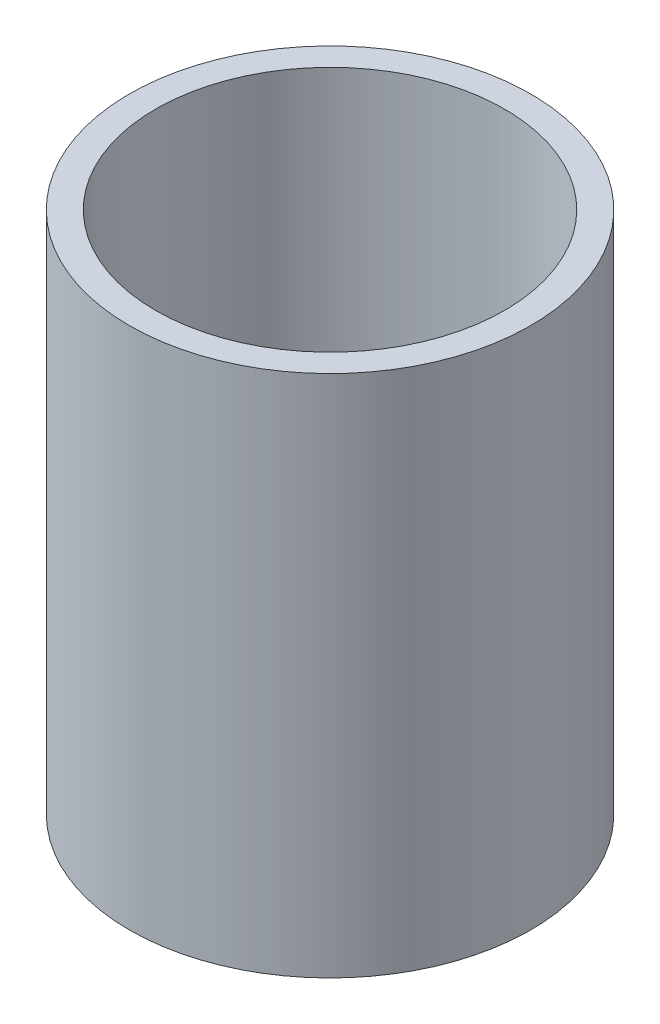
ISO-10303-21;
HEADER;
FILE_DESCRIPTION(('STEP AP214'),'2;1');
FILE_NAME('part.step','',(''),(''),'','','');
FILE_SCHEMA(('AUTOMOTIVE_DESIGN { 1 0 10303 214 1 1 1 1 }'));
ENDSEC;
DATA;
#1=APPLICATION_CONTEXT('core data for automotive mechanical design processes');
#2=APPLICATION_PROTOCOL_DEFINITION('international standard','automotive_design',2000,#1);
#3=PRODUCT_CONTEXT('',#1,'mechanical');
#4=PRODUCT('Part','Part','',(#3));
#5=PRODUCT_RELATED_PRODUCT_CATEGORY('part','',(#4));
#6=PRODUCT_DEFINITION_FORMATION('','',#4);
#7=PRODUCT_DEFINITION_CONTEXT('part definition',#1,'design');
#8=PRODUCT_DEFINITION('design','',#6,#7);
#9=PRODUCT_DEFINITION_SHAPE('','',#8);
#10=(LENGTH_UNIT() NAMED_UNIT(*) SI_UNIT(.MILLI.,.METRE.));
#11=(NAMED_UNIT(*) PLANE_ANGLE_UNIT() SI_UNIT($,.RADIAN.));
#12=(NAMED_UNIT(*) SI_UNIT($,.STERADIAN.) SOLID_ANGLE_UNIT());
#13=UNCERTAINTY_MEASURE_WITH_UNIT(LENGTH_MEASURE(1.E-05),#10,'distance_accuracy_value','');
#14=(GEOMETRIC_REPRESENTATION_CONTEXT(3) GLOBAL_UNCERTAINTY_ASSIGNED_CONTEXT((#13)) GLOBAL_UNIT_ASSIGNED_CONTEXT((#10,
#11,#12)) REPRESENTATION_CONTEXT('',''));
#15=CARTESIAN_POINT('',(0.,0.,0.));
#16=DIRECTION('',(0.,0.,1.));
#17=DIRECTION('',(1.,0.,0.));
#18=AXIS2_PLACEMENT_3D('',#15,#16,#17);
#19=CARTESIAN_POINT('',(0.,60.,0.));
#20=DIRECTION('',(0.,-1.,0.));
#21=DIRECTION('',(0.,0.,-1.));
#22=AXIS2_PLACEMENT_3D('',#19,#20,#21);
#23=CYLINDRICAL_SURFACE('',#22,23.);
#24=CARTESIAN_POINT('',(0.,60.,0.));
#25=DIRECTION('',(0.,1.,0.));
#26=DIRECTION('',(0.,0.,1.));
#27=AXIS2_PLACEMENT_3D('',#24,#25,#26);
#28=CIRCLE('',#27,23.);
#29=CARTESIAN_POINT('',(0.,60.,23.));
#30=VERTEX_POINT('',#29);
#31=EDGE_CURVE('E10',#30,#30,#28,.T.);
#32=ORIENTED_EDGE('',*,*,#31,.F.);
#33=EDGE_LOOP('',(#32));
#34=FACE_BOUND('',#33,.T.);
#35=CARTESIAN_POINT('',(0.,0.,0.));
#36=DIRECTION('',(0.,1.,0.));
#37=DIRECTION('',(0.,0.,1.));
#38=AXIS2_PLACEMENT_3D('',#35,#36,#37);
#39=CIRCLE('',#38,23.);
#40=CARTESIAN_POINT('',(0.,0.,23.));
#41=VERTEX_POINT('',#40);
#42=EDGE_CURVE('E45',#41,#41,#39,.T.);
#43=ORIENTED_EDGE('',*,*,#42,.T.);
#44=EDGE_LOOP('',(#43));
#45=FACE_BOUND('',#44,.T.);
#46=ADVANCED_FACE('F37',(#34,#45),#23,.T.);
#47=CARTESIAN_POINT('',(0.,60.,0.));
#48=DIRECTION('',(0.,1.,0.));
#49=DIRECTION('',(0.,0.,1.));
#50=AXIS2_PLACEMENT_3D('',#47,#48,#49);
#51=PLANE('',#50);
#52=CARTESIAN_POINT('',(0.,60.,0.));
#53=DIRECTION('',(0.,1.,0.));
#54=DIRECTION('',(0.,0.,1.));
#55=AXIS2_PLACEMENT_3D('',#52,#53,#54);
#56=CIRCLE('',#55,20.);
#57=CARTESIAN_POINT('',(0.,60.,20.));
#58=VERTEX_POINT('',#57);
#59=EDGE_CURVE('E61',#58,#58,#56,.T.);
#60=ORIENTED_EDGE('',*,*,#59,.F.);
#61=EDGE_LOOP('',(#60));
#62=FACE_BOUND('',#61,.T.);
#63=ORIENTED_EDGE('',*,*,#31,.T.);
#64=EDGE_LOOP('',(#63));
#65=FACE_BOUND('',#64,.T.);
#66=ADVANCED_FACE('F92',(#62,#65),#51,.T.);
#67=CARTESIAN_POINT('',(0.,0.,0.));
#68=DIRECTION('',(0.,1.,0.));
#69=DIRECTION('',(0.,0.,1.));
#70=AXIS2_PLACEMENT_3D('',#67,#68,#69);
#71=PLANE('',#70);
#72=CARTESIAN_POINT('',(0.,0.,0.));
#73=DIRECTION('',(0.,-1.,0.));
#74=DIRECTION('',(0.,0.,-1.));
#75=AXIS2_PLACEMENT_3D('',#72,#73,#74);
#76=CIRCLE('',#75,20.);
#77=CARTESIAN_POINT('',(0.,0.,-20.));
#78=VERTEX_POINT('',#77);
#79=EDGE_CURVE('E53',#78,#78,#76,.T.);
#80=ORIENTED_EDGE('',*,*,#79,.F.);
#81=EDGE_LOOP('',(#80));
#82=FACE_BOUND('',#81,.T.);
#83=ORIENTED_EDGE('',*,*,#42,.F.);
#84=EDGE_LOOP('',(#83));
#85=FACE_BOUND('',#84,.T.);
#86=ADVANCED_FACE('F94',(#82,#85),#71,.F.);
#87=CARTESIAN_POINT('',(0.,22.,0.));
#88=DIRECTION('',(0.,-1.,0.));
#89=DIRECTION('',(0.,0.,-1.));
#90=AXIS2_PLACEMENT_3D('',#87,#88,#89);
#91=CYLINDRICAL_SURFACE('',#90,20.);
#92=CARTESIAN_POINT('',(0.,22.,0.));
#93=DIRECTION('',(0.,-1.,0.));
#94=DIRECTION('',(0.,0.,-1.));
#95=AXIS2_PLACEMENT_3D('',#92,#93,#94);
#96=CIRCLE('',#95,20.);
#97=CARTESIAN_POINT('',(0.,22.,-20.));
#98=VERTEX_POINT('',#97);
#99=EDGE_CURVE('E51',#98,#98,#96,.T.);
#100=ORIENTED_EDGE('',*,*,#99,.F.);
#101=EDGE_LOOP('',(#100));
#102=FACE_BOUND('',#101,.T.);
#103=ORIENTED_EDGE('',*,*,#79,.T.);
#104=EDGE_LOOP('',(#103));
#105=FACE_BOUND('',#104,.T.);
#106=ADVANCED_FACE('F100',(#102,#105),#91,.F.);
#107=CARTESIAN_POINT('',(0.,22.,0.));
#108=DIRECTION('',(0.,-1.,0.));
#109=DIRECTION('',(0.,0.,-1.));
#110=AXIS2_PLACEMENT_3D('',#107,#108,#109);
#111=PLANE('',#110);
#112=CARTESIAN_POINT('',(0.,22.,0.));
#113=DIRECTION('',(0.,-1.,0.));
#114=DIRECTION('',(0.,0.,-1.));
#115=AXIS2_PLACEMENT_3D('',#112,#113,#114);
#116=CIRCLE('',#115,2.);
#117=CARTESIAN_POINT('',(0.,22.,-2.));
#118=VERTEX_POINT('',#117);
#119=EDGE_CURVE('E68',#118,#118,#116,.T.);
#120=ORIENTED_EDGE('',*,*,#119,.F.);
#121=EDGE_LOOP('',(#120));
#122=FACE_BOUND('',#121,.T.);
#123=ORIENTED_EDGE('',*,*,#99,.T.);
#124=EDGE_LOOP('',(#123));
#125=FACE_BOUND('',#124,.T.);
#126=ADVANCED_FACE('F88',(#122,#125),#111,.T.);
#127=CARTESIAN_POINT('',(0.,28.,0.));
#128=DIRECTION('',(0.,1.,0.));
#129=DIRECTION('',(0.,0.,1.));
#130=AXIS2_PLACEMENT_3D('',#127,#128,#129);
#131=CYLINDRICAL_SURFACE('',#130,20.);
#132=CARTESIAN_POINT('',(0.,28.,0.));
#133=DIRECTION('',(0.,1.,0.));
#134=DIRECTION('',(0.,0.,1.));
#135=AXIS2_PLACEMENT_3D('',#132,#133,#134);
#136=CIRCLE('',#135,20.);
#137=CARTESIAN_POINT('',(0.,28.,20.));
#138=VERTEX_POINT('',#137);
#139=EDGE_CURVE('E57',#138,#138,#136,.T.);
#140=ORIENTED_EDGE('',*,*,#139,.F.);
#141=EDGE_LOOP('',(#140));
#142=FACE_BOUND('',#141,.T.);
#143=ORIENTED_EDGE('',*,*,#59,.T.);
#144=EDGE_LOOP('',(#143));
#145=FACE_BOUND('',#144,.T.);
#146=ADVANCED_FACE('F82',(#142,#145),#131,.F.);
#147=CARTESIAN_POINT('',(0.,28.,0.));
#148=DIRECTION('',(0.,1.,0.));
#149=DIRECTION('',(0.,0.,1.));
#150=AXIS2_PLACEMENT_3D('',#147,#148,#149);
#151=PLANE('',#150);
#152=CARTESIAN_POINT('',(0.,28.,0.));
#153=DIRECTION('',(0.,1.,0.));
#154=DIRECTION('',(0.,0.,1.));
#155=AXIS2_PLACEMENT_3D('',#152,#153,#154);
#156=CIRCLE('',#155,2.);
#157=CARTESIAN_POINT('',(0.,28.,2.));
#158=VERTEX_POINT('',#157);
#159=EDGE_CURVE('E40',#158,#158,#156,.T.);
#160=ORIENTED_EDGE('',*,*,#159,.F.);
#161=EDGE_LOOP('',(#160));
#162=FACE_BOUND('',#161,.T.);
#163=ORIENTED_EDGE('',*,*,#139,.T.);
#164=EDGE_LOOP('',(#163));
#165=FACE_BOUND('',#164,.T.);
#166=ADVANCED_FACE('F79',(#162,#165),#151,.T.);
#167=CARTESIAN_POINT('',(0.,62.,0.));
#168=DIRECTION('',(0.,-1.,0.));
#169=DIRECTION('',(0.,0.,-1.));
#170=AXIS2_PLACEMENT_3D('',#167,#168,#169);
#171=CYLINDRICAL_SURFACE('',#170,2.);
#172=ORIENTED_EDGE('',*,*,#159,.T.);
#173=EDGE_LOOP('',(#172));
#174=FACE_BOUND('',#173,.T.);
#175=ORIENTED_EDGE('',*,*,#119,.T.);
#176=EDGE_LOOP('',(#175));
#177=FACE_BOUND('',#176,.T.);
#178=ADVANCED_FACE('F77',(#174,#177),#171,.F.);
#179=CLOSED_SHELL('',(#46,#66,#86,#106,#126,#146,#166,#178));
#180=MANIFOLD_SOLID_BREP('B2',#179);
#181=ADVANCED_BREP_SHAPE_REPRESENTATION('',(#18,#180),#14);
#182=SHAPE_DEFINITION_REPRESENTATION(#9,#181);
ENDSEC;
END-ISO-10303-21;
